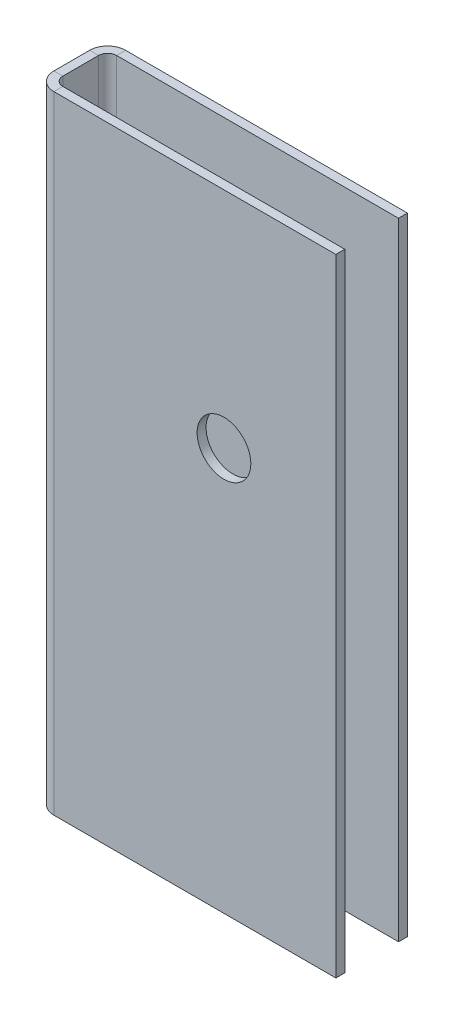
ISO-10303-21;
HEADER;
FILE_DESCRIPTION(('STEP AP214'),'2;1');
FILE_NAME('part.step','',(''),(''),'','','');
FILE_SCHEMA(('AUTOMOTIVE_DESIGN { 1 0 10303 214 1 1 1 1 }'));
ENDSEC;
DATA;
#1=APPLICATION_CONTEXT('core data for automotive mechanical design processes');
#2=APPLICATION_PROTOCOL_DEFINITION('international standard','automotive_design',2000,#1);
#3=PRODUCT_CONTEXT('',#1,'mechanical');
#4=PRODUCT('Part','Part','',(#3));
#5=PRODUCT_RELATED_PRODUCT_CATEGORY('part','',(#4));
#6=PRODUCT_DEFINITION_FORMATION('','',#4);
#7=PRODUCT_DEFINITION_CONTEXT('part definition',#1,'design');
#8=PRODUCT_DEFINITION('design','',#6,#7);
#9=PRODUCT_DEFINITION_SHAPE('','',#8);
#10=(LENGTH_UNIT() NAMED_UNIT(*) SI_UNIT(.MILLI.,.METRE.));
#11=(NAMED_UNIT(*) PLANE_ANGLE_UNIT() SI_UNIT($,.RADIAN.));
#12=(NAMED_UNIT(*) SI_UNIT($,.STERADIAN.) SOLID_ANGLE_UNIT());
#13=UNCERTAINTY_MEASURE_WITH_UNIT(LENGTH_MEASURE(1.E-05),#10,'distance_accuracy_value','');
#14=(GEOMETRIC_REPRESENTATION_CONTEXT(3) GLOBAL_UNCERTAINTY_ASSIGNED_CONTEXT((#13)) GLOBAL_UNIT_ASSIGNED_CONTEXT((#10,
#11,#12)) REPRESENTATION_CONTEXT('',''));
#15=CARTESIAN_POINT('',(0.,0.,0.));
#16=DIRECTION('',(0.,0.,1.));
#17=DIRECTION('',(1.,0.,0.));
#18=AXIS2_PLACEMENT_3D('',#15,#16,#17);
#19=CARTESIAN_POINT('',(-1073.5,140.,-8.00000000000001));
#20=DIRECTION('',(0.,1.,0.));
#21=DIRECTION('',(0.,0.,1.));
#22=AXIS2_PLACEMENT_3D('',#19,#20,#21);
#23=PLANE('',#22);
#24=DIRECTION('',(0.,0.,1.));
#25=VECTOR('',#24,1.);
#26=CARTESIAN_POINT('',(-1075.5,140.,-6.00000000000001));
#27=LINE('',#26,#25);
#28=CARTESIAN_POINT('',(-1075.5,140.,-4.));
#29=VERTEX_POINT('',#28);
#30=CARTESIAN_POINT('',(-1075.5,140.,3.99999999999993));
#31=VERTEX_POINT('',#30);
#32=EDGE_CURVE('E150',#29,#31,#27,.T.);
#33=ORIENTED_EDGE('',*,*,#32,.F.);
#34=DIRECTION('',(-1.,0.,0.));
#35=VECTOR('',#34,1.);
#36=CARTESIAN_POINT('',(-1075.5,140.,-4.));
#37=LINE('',#36,#35);
#38=CARTESIAN_POINT('',(-1077.5,140.,-4.));
#39=VERTEX_POINT('',#38);
#40=EDGE_CURVE('E146',#29,#39,#37,.T.);
#41=ORIENTED_EDGE('',*,*,#40,.T.);
#42=DIRECTION('',(0.,0.,-1.));
#43=VECTOR('',#42,1.);
#44=CARTESIAN_POINT('',(-1077.5,140.,-6.00000000000001));
#45=LINE('',#44,#43);
#46=CARTESIAN_POINT('',(-1077.5,140.,3.99999999999987));
#47=VERTEX_POINT('',#46);
#48=EDGE_CURVE('E155',#39,#47,#45,.F.);
#49=ORIENTED_EDGE('',*,*,#48,.T.);
#50=DIRECTION('',(1.,0.,0.));
#51=VECTOR('',#50,1.);
#52=CARTESIAN_POINT('',(-1077.5,140.,4.));
#53=LINE('',#52,#51);
#54=EDGE_CURVE('E129',#47,#31,#53,.T.);
#55=ORIENTED_EDGE('',*,*,#54,.T.);
#56=EDGE_LOOP('',(#33,#41,#49,#55));
#57=FACE_BOUND('',#56,.T.);
#58=ADVANCED_FACE('F36',(#57),#23,.T.);
#59=CARTESIAN_POINT('',(-1073.5,0.,8.00000000000001));
#60=DIRECTION('',(0.,-1.,0.));
#61=DIRECTION('',(0.,0.,-1.));
#62=AXIS2_PLACEMENT_3D('',#59,#60,#61);
#63=PLANE('',#62);
#64=DIRECTION('',(0.,0.,1.));
#65=VECTOR('',#64,1.);
#66=CARTESIAN_POINT('',(-1075.5,0.,-6.00000000000001));
#67=LINE('',#66,#65);
#68=CARTESIAN_POINT('',(-1075.5,0.,-4.));
#69=VERTEX_POINT('',#68);
#70=CARTESIAN_POINT('',(-1075.5,0.,3.99999999999994));
#71=VERTEX_POINT('',#70);
#72=EDGE_CURVE('E172',#69,#71,#67,.T.);
#73=ORIENTED_EDGE('',*,*,#72,.T.);
#74=DIRECTION('',(-1.,0.,0.));
#75=VECTOR('',#74,1.);
#76=CARTESIAN_POINT('',(-1075.5,0.,4.));
#77=LINE('',#76,#75);
#78=CARTESIAN_POINT('',(-1077.5,0.,4.));
#79=VERTEX_POINT('',#78);
#80=EDGE_CURVE('E11',#71,#79,#77,.T.);
#81=ORIENTED_EDGE('',*,*,#80,.T.);
#82=DIRECTION('',(0.,0.,-1.));
#83=VECTOR('',#82,1.);
#84=CARTESIAN_POINT('',(-1077.5,0.,-6.00000000000001));
#85=LINE('',#84,#83);
#86=CARTESIAN_POINT('',(-1077.5,0.,-4.));
#87=VERTEX_POINT('',#86);
#88=EDGE_CURVE('E156',#87,#79,#85,.F.);
#89=ORIENTED_EDGE('',*,*,#88,.F.);
#90=DIRECTION('',(1.,0.,0.));
#91=VECTOR('',#90,1.);
#92=CARTESIAN_POINT('',(-1077.5,0.,-4.));
#93=LINE('',#92,#91);
#94=EDGE_CURVE('E166',#87,#69,#93,.T.);
#95=ORIENTED_EDGE('',*,*,#94,.T.);
#96=EDGE_LOOP('',(#73,#81,#89,#95));
#97=FACE_BOUND('',#96,.T.);
#98=ADVANCED_FACE('F277',(#97),#63,.T.);
#99=CARTESIAN_POINT('',(-1075.5,140.,-6.00000000000001));
#100=DIRECTION('',(1.,0.,0.));
#101=DIRECTION('',(0.,0.,-1.));
#102=AXIS2_PLACEMENT_3D('',#99,#100,#101);
#103=PLANE('',#102);
#104=ORIENTED_EDGE('',*,*,#72,.F.);
#105=DIRECTION('',(0.,-1.,0.));
#106=VECTOR('',#105,1.);
#107=CARTESIAN_POINT('',(-1075.5,140.,-4.));
#108=LINE('',#107,#106);
#109=EDGE_CURVE('E152',#29,#69,#108,.T.);
#110=ORIENTED_EDGE('',*,*,#109,.F.);
#111=ORIENTED_EDGE('',*,*,#32,.T.);
#112=DIRECTION('',(0.,-1.,0.));
#113=VECTOR('',#112,1.);
#114=CARTESIAN_POINT('',(-1075.5,140.,4.));
#115=LINE('',#114,#113);
#116=EDGE_CURVE('E139',#31,#71,#115,.T.);
#117=ORIENTED_EDGE('',*,*,#116,.T.);
#118=EDGE_LOOP('',(#104,#110,#111,#117));
#119=FACE_BOUND('',#118,.T.);
#120=ADVANCED_FACE('F151',(#119),#103,.T.);
#121=CARTESIAN_POINT('',(-1077.5,140.,-6.00000000000001));
#122=DIRECTION('',(1.,0.,0.));
#123=DIRECTION('',(0.,0.,-1.));
#124=AXIS2_PLACEMENT_3D('',#121,#122,#123);
#125=PLANE('',#124);
#126=ORIENTED_EDGE('',*,*,#88,.T.);
#127=DIRECTION('',(0.,-1.,0.));
#128=VECTOR('',#127,1.);
#129=CARTESIAN_POINT('',(-1077.5,140.,4.));
#130=LINE('',#129,#128);
#131=EDGE_CURVE('E43',#47,#79,#130,.T.);
#132=ORIENTED_EDGE('',*,*,#131,.F.);
#133=ORIENTED_EDGE('',*,*,#48,.F.);
#134=DIRECTION('',(0.,-1.,0.));
#135=VECTOR('',#134,1.);
#136=CARTESIAN_POINT('',(-1077.5,140.,-4.));
#137=LINE('',#136,#135);
#138=EDGE_CURVE('E163',#39,#87,#137,.T.);
#139=ORIENTED_EDGE('',*,*,#138,.T.);
#140=EDGE_LOOP('',(#126,#132,#133,#139));
#141=FACE_BOUND('',#140,.T.);
#142=ADVANCED_FACE('F285',(#141),#125,.F.);
#143=CARTESIAN_POINT('',(-1073.5,140.,-4.));
#144=DIRECTION('',(0.,-1.,0.));
#145=DIRECTION('',(1.,0.,0.));
#146=AXIS2_PLACEMENT_3D('',#143,#144,#145);
#147=PLANE('',#146);
#148=DIRECTION('',(0.,0.,1.));
#149=VECTOR('',#148,1.);
#150=CARTESIAN_POINT('',(-1073.5,140.,-8.00000000000001));
#151=LINE('',#150,#149);
#152=CARTESIAN_POINT('',(-1073.5,140.,-8.00000000000001));
#153=VERTEX_POINT('',#152);
#154=CARTESIAN_POINT('',(-1073.5,140.,-6.00000000000001));
#155=VERTEX_POINT('',#154);
#156=EDGE_CURVE('E178',#153,#155,#151,.T.);
#157=ORIENTED_EDGE('',*,*,#156,.F.);
#158=CARTESIAN_POINT('',(-1073.5,140.,-4.));
#159=DIRECTION('',(0.,1.,0.));
#160=DIRECTION('',(-1.,0.,0.));
#161=AXIS2_PLACEMENT_3D('',#158,#159,#160);
#162=CIRCLE('',#161,4.);
#163=EDGE_CURVE('E57',#153,#39,#162,.T.);
#164=ORIENTED_EDGE('',*,*,#163,.T.);
#165=ORIENTED_EDGE('',*,*,#40,.F.);
#166=CARTESIAN_POINT('',(-1073.5,140.,-4.));
#167=DIRECTION('',(0.,1.,0.));
#168=DIRECTION('',(-1.,0.,0.));
#169=AXIS2_PLACEMENT_3D('',#166,#167,#168);
#170=CIRCLE('',#169,2.);
#171=EDGE_CURVE('E181',#155,#29,#170,.T.);
#172=ORIENTED_EDGE('',*,*,#171,.F.);
#173=EDGE_LOOP('',(#157,#164,#165,#172));
#174=FACE_BOUND('',#173,.T.);
#175=ADVANCED_FACE('F290',(#174),#147,.F.);
#176=CARTESIAN_POINT('',(-1073.5,0.,-4.));
#177=DIRECTION('',(0.,1.,0.));
#178=DIRECTION('',(-1.,0.,0.));
#179=AXIS2_PLACEMENT_3D('',#176,#177,#178);
#180=PLANE('',#179);
#181=ORIENTED_EDGE('',*,*,#94,.F.);
#182=CARTESIAN_POINT('',(-1073.5,0.,-4.));
#183=DIRECTION('',(0.,1.,0.));
#184=DIRECTION('',(-1.,0.,0.));
#185=AXIS2_PLACEMENT_3D('',#182,#183,#184);
#186=CIRCLE('',#185,4.);
#187=CARTESIAN_POINT('',(-1073.5,0.,-8.00000000000001));
#188=VERTEX_POINT('',#187);
#189=EDGE_CURVE('E177',#87,#188,#186,.F.);
#190=ORIENTED_EDGE('',*,*,#189,.T.);
#191=DIRECTION('',(0.,0.,-1.));
#192=VECTOR('',#191,1.);
#193=CARTESIAN_POINT('',(-1073.5,0.,-6.00000000000001));
#194=LINE('',#193,#192);
#195=CARTESIAN_POINT('',(-1073.5,0.,-6.00000000000001));
#196=VERTEX_POINT('',#195);
#197=EDGE_CURVE('E202',#196,#188,#194,.T.);
#198=ORIENTED_EDGE('',*,*,#197,.F.);
#199=CARTESIAN_POINT('',(-1073.5,0.,-4.));
#200=DIRECTION('',(0.,-1.,0.));
#201=DIRECTION('',(1.,0.,0.));
#202=AXIS2_PLACEMENT_3D('',#199,#200,#201);
#203=CIRCLE('',#202,2.);
#204=EDGE_CURVE('E174',#69,#196,#203,.T.);
#205=ORIENTED_EDGE('',*,*,#204,.F.);
#206=EDGE_LOOP('',(#181,#190,#198,#205));
#207=FACE_BOUND('',#206,.T.);
#208=ADVANCED_FACE('F294',(#207),#180,.F.);
#209=CARTESIAN_POINT('',(-1073.5,-70.0714157829591,-4.));
#210=DIRECTION('',(0.,1.,0.));
#211=DIRECTION('',(-1.,0.,0.));
#212=AXIS2_PLACEMENT_3D('',#209,#210,#211);
#213=CYLINDRICAL_SURFACE('',#212,2.);
#214=ORIENTED_EDGE('',*,*,#204,.T.);
#215=DIRECTION('',(0.,-1.,0.));
#216=VECTOR('',#215,1.);
#217=CARTESIAN_POINT('',(-1073.5,140.,-6.00000000000001));
#218=LINE('',#217,#216);
#219=EDGE_CURVE('E197',#155,#196,#218,.T.);
#220=ORIENTED_EDGE('',*,*,#219,.F.);
#221=ORIENTED_EDGE('',*,*,#171,.T.);
#222=ORIENTED_EDGE('',*,*,#109,.T.);
#223=EDGE_LOOP('',(#214,#220,#221,#222));
#224=FACE_BOUND('',#223,.T.);
#225=ADVANCED_FACE('F297',(#224),#213,.F.);
#226=CARTESIAN_POINT('',(-1073.5,-70.0714157829591,-4.));
#227=DIRECTION('',(0.,1.,0.));
#228=DIRECTION('',(-1.,0.,0.));
#229=AXIS2_PLACEMENT_3D('',#226,#227,#228);
#230=CYLINDRICAL_SURFACE('',#229,4.);
#231=ORIENTED_EDGE('',*,*,#189,.F.);
#232=ORIENTED_EDGE('',*,*,#138,.F.);
#233=ORIENTED_EDGE('',*,*,#163,.F.);
#234=DIRECTION('',(0.,-1.,0.));
#235=VECTOR('',#234,1.);
#236=CARTESIAN_POINT('',(-1073.5,140.,-8.00000000000001));
#237=LINE('',#236,#235);
#238=EDGE_CURVE('E186',#153,#188,#237,.T.);
#239=ORIENTED_EDGE('',*,*,#238,.T.);
#240=EDGE_LOOP('',(#231,#232,#233,#239));
#241=FACE_BOUND('',#240,.T.);
#242=ADVANCED_FACE('F299',(#241),#230,.T.);
#243=CARTESIAN_POINT('',(-1010.5,140.,-8.00000000000001));
#244=DIRECTION('',(1.,0.,0.));
#245=DIRECTION('',(0.,0.,-1.));
#246=AXIS2_PLACEMENT_3D('',#243,#244,#245);
#247=PLANE('',#246);
#248=DIRECTION('',(0.,0.,1.));
#249=VECTOR('',#248,1.);
#250=CARTESIAN_POINT('',(-1010.5,0.,-8.00000000000001));
#251=LINE('',#250,#249);
#252=CARTESIAN_POINT('',(-1010.5,0.,-8.00000000000001));
#253=VERTEX_POINT('',#252);
#254=CARTESIAN_POINT('',(-1010.5,0.,-6.00000000000001));
#255=VERTEX_POINT('',#254);
#256=EDGE_CURVE('E205',#253,#255,#251,.T.);
#257=ORIENTED_EDGE('',*,*,#256,.F.);
#258=DIRECTION('',(0.,-1.,0.));
#259=VECTOR('',#258,1.);
#260=CARTESIAN_POINT('',(-1010.5,140.,-8.00000000000001));
#261=LINE('',#260,#259);
#262=CARTESIAN_POINT('',(-1010.5,140.,-8.00000000000001));
#263=VERTEX_POINT('',#262);
#264=EDGE_CURVE('E210',#263,#253,#261,.T.);
#265=ORIENTED_EDGE('',*,*,#264,.F.);
#266=DIRECTION('',(0.,0.,1.));
#267=VECTOR('',#266,1.);
#268=CARTESIAN_POINT('',(-1010.5,140.,-8.00000000000001));
#269=LINE('',#268,#267);
#270=CARTESIAN_POINT('',(-1010.5,140.,-6.00000000000001));
#271=VERTEX_POINT('',#270);
#272=EDGE_CURVE('E189',#263,#271,#269,.T.);
#273=ORIENTED_EDGE('',*,*,#272,.T.);
#274=DIRECTION('',(0.,-1.,0.));
#275=VECTOR('',#274,1.);
#276=CARTESIAN_POINT('',(-1010.5,140.,-6.00000000000001));
#277=LINE('',#276,#275);
#278=EDGE_CURVE('E193',#271,#255,#277,.T.);
#279=ORIENTED_EDGE('',*,*,#278,.T.);
#280=EDGE_LOOP('',(#257,#265,#273,#279));
#281=FACE_BOUND('',#280,.T.);
#282=ADVANCED_FACE('F302',(#281),#247,.T.);
#283=CARTESIAN_POINT('',(-1010.5,140.,-6.00000000000001));
#284=DIRECTION('',(0.,0.,1.));
#285=DIRECTION('',(1.,0.,0.));
#286=AXIS2_PLACEMENT_3D('',#283,#284,#285);
#287=PLANE('',#286);
#288=CARTESIAN_POINT('',(-1035.5,90.,-6.00000000000001));
#289=DIRECTION('',(0.,0.,1.));
#290=DIRECTION('',(1.,0.,0.));
#291=AXIS2_PLACEMENT_3D('',#288,#289,#290);
#292=CIRCLE('',#291,6.0000000000001);
#293=CARTESIAN_POINT('',(-1029.5,90.,-6.00000000000001));
#294=VERTEX_POINT('',#293);
#295=EDGE_CURVE('E247',#294,#294,#292,.T.);
#296=ORIENTED_EDGE('',*,*,#295,.F.);
#297=EDGE_LOOP('',(#296));
#298=FACE_BOUND('',#297,.T.);
#299=DIRECTION('',(-1.,0.,0.));
#300=VECTOR('',#299,1.);
#301=CARTESIAN_POINT('',(-1010.5,0.,-6.00000000000001));
#302=LINE('',#301,#300);
#303=EDGE_CURVE('E200',#255,#196,#302,.T.);
#304=ORIENTED_EDGE('',*,*,#303,.F.);
#305=ORIENTED_EDGE('',*,*,#278,.F.);
#306=DIRECTION('',(-1.,0.,0.));
#307=VECTOR('',#306,1.);
#308=CARTESIAN_POINT('',(-1010.5,140.,-6.00000000000001));
#309=LINE('',#308,#307);
#310=EDGE_CURVE('E195',#271,#155,#309,.T.);
#311=ORIENTED_EDGE('',*,*,#310,.T.);
#312=ORIENTED_EDGE('',*,*,#219,.T.);
#313=EDGE_LOOP('',(#304,#305,#311,#312));
#314=FACE_BOUND('',#313,.T.);
#315=ADVANCED_FACE('F317',(#298,#314),#287,.T.);
#316=CARTESIAN_POINT('',(-1077.5,0.,-4.));
#317=DIRECTION('',(0.,-1.,0.));
#318=DIRECTION('',(0.,0.,-1.));
#319=AXIS2_PLACEMENT_3D('',#316,#317,#318);
#320=PLANE('',#319);
#321=ORIENTED_EDGE('',*,*,#303,.T.);
#322=ORIENTED_EDGE('',*,*,#197,.T.);
#323=DIRECTION('',(1.,0.,0.));
#324=VECTOR('',#323,1.);
#325=CARTESIAN_POINT('',(-1010.5,0.,-8.00000000000001));
#326=LINE('',#325,#324);
#327=EDGE_CURVE('E208',#253,#188,#326,.F.);
#328=ORIENTED_EDGE('',*,*,#327,.F.);
#329=ORIENTED_EDGE('',*,*,#256,.T.);
#330=EDGE_LOOP('',(#321,#322,#328,#329));
#331=FACE_BOUND('',#330,.T.);
#332=ADVANCED_FACE('F314',(#331),#320,.T.);
#333=CARTESIAN_POINT('',(-1010.5,140.,-8.00000000000001));
#334=DIRECTION('',(0.,0.,1.));
#335=DIRECTION('',(1.,0.,0.));
#336=AXIS2_PLACEMENT_3D('',#333,#334,#335);
#337=PLANE('',#336);
#338=CARTESIAN_POINT('',(-1035.5,90.,-8.00000000000001));
#339=DIRECTION('',(0.,0.,1.));
#340=DIRECTION('',(1.,0.,0.));
#341=AXIS2_PLACEMENT_3D('',#338,#339,#340);
#342=CIRCLE('',#341,6.0000000000001);
#343=CARTESIAN_POINT('',(-1029.5,90.,-8.00000000000001));
#344=VERTEX_POINT('',#343);
#345=EDGE_CURVE('E255',#344,#344,#342,.T.);
#346=ORIENTED_EDGE('',*,*,#345,.T.);
#347=EDGE_LOOP('',(#346));
#348=FACE_BOUND('',#347,.T.);
#349=ORIENTED_EDGE('',*,*,#327,.T.);
#350=ORIENTED_EDGE('',*,*,#238,.F.);
#351=DIRECTION('',(1.,0.,0.));
#352=VECTOR('',#351,1.);
#353=CARTESIAN_POINT('',(-1010.5,140.,-8.00000000000001));
#354=LINE('',#353,#352);
#355=EDGE_CURVE('E212',#263,#153,#354,.F.);
#356=ORIENTED_EDGE('',*,*,#355,.F.);
#357=ORIENTED_EDGE('',*,*,#264,.T.);
#358=EDGE_LOOP('',(#349,#350,#356,#357));
#359=FACE_BOUND('',#358,.T.);
#360=ADVANCED_FACE('F262',(#348,#359),#337,.F.);
#361=CARTESIAN_POINT('',(-1073.5,140.,4.));
#362=DIRECTION('',(0.,-1.,0.));
#363=DIRECTION('',(-1.,0.,0.));
#364=AXIS2_PLACEMENT_3D('',#361,#362,#363);
#365=PLANE('',#364);
#366=ORIENTED_EDGE('',*,*,#355,.T.);
#367=ORIENTED_EDGE('',*,*,#156,.T.);
#368=ORIENTED_EDGE('',*,*,#310,.F.);
#369=ORIENTED_EDGE('',*,*,#272,.F.);
#370=EDGE_LOOP('',(#366,#367,#368,#369));
#371=FACE_BOUND('',#370,.T.);
#372=ADVANCED_FACE('F307',(#371),#365,.F.);
#373=CARTESIAN_POINT('',(-1010.5,140.,6.));
#374=DIRECTION('',(1.,0.,0.));
#375=DIRECTION('',(0.,0.,-1.));
#376=AXIS2_PLACEMENT_3D('',#373,#374,#375);
#377=PLANE('',#376);
#378=DIRECTION('',(0.,0.,1.));
#379=VECTOR('',#378,1.);
#380=CARTESIAN_POINT('',(-1010.5,0.,6.));
#381=LINE('',#380,#379);
#382=CARTESIAN_POINT('',(-1010.5,0.,6.));
#383=VERTEX_POINT('',#382);
#384=CARTESIAN_POINT('',(-1010.5,0.,8.));
#385=VERTEX_POINT('',#384);
#386=EDGE_CURVE('E190',#383,#385,#381,.T.);
#387=ORIENTED_EDGE('',*,*,#386,.F.);
#388=DIRECTION('',(0.,-1.,0.));
#389=VECTOR('',#388,1.);
#390=CARTESIAN_POINT('',(-1010.5,140.,6.));
#391=LINE('',#390,#389);
#392=CARTESIAN_POINT('',(-1010.5,140.,6.));
#393=VERTEX_POINT('',#392);
#394=EDGE_CURVE('E226',#393,#383,#391,.T.);
#395=ORIENTED_EDGE('',*,*,#394,.F.);
#396=DIRECTION('',(0.,0.,1.));
#397=VECTOR('',#396,1.);
#398=CARTESIAN_POINT('',(-1010.5,140.,6.));
#399=LINE('',#398,#397);
#400=CARTESIAN_POINT('',(-1010.5,140.,8.));
#401=VERTEX_POINT('',#400);
#402=EDGE_CURVE('E218',#393,#401,#399,.T.);
#403=ORIENTED_EDGE('',*,*,#402,.T.);
#404=DIRECTION('',(0.,-1.,0.));
#405=VECTOR('',#404,1.);
#406=CARTESIAN_POINT('',(-1010.5,140.,8.));
#407=LINE('',#406,#405);
#408=EDGE_CURVE('E221',#401,#385,#407,.T.);
#409=ORIENTED_EDGE('',*,*,#408,.T.);
#410=EDGE_LOOP('',(#387,#395,#403,#409));
#411=FACE_BOUND('',#410,.T.);
#412=ADVANCED_FACE('F310',(#411),#377,.T.);
#413=CARTESIAN_POINT('',(-1075.5,140.,6.));
#414=DIRECTION('',(0.,0.,-1.));
#415=DIRECTION('',(-1.,0.,0.));
#416=AXIS2_PLACEMENT_3D('',#413,#414,#415);
#417=PLANE('',#416);
#418=CARTESIAN_POINT('',(-1035.5,90.,6.));
#419=DIRECTION('',(0.,0.,-1.));
#420=DIRECTION('',(-1.,0.,0.));
#421=AXIS2_PLACEMENT_3D('',#418,#419,#420);
#422=CIRCLE('',#421,6.0000000000001);
#423=CARTESIAN_POINT('',(-1041.5,90.,6.));
#424=VERTEX_POINT('',#423);
#425=EDGE_CURVE('E252',#424,#424,#422,.T.);
#426=ORIENTED_EDGE('',*,*,#425,.F.);
#427=EDGE_LOOP('',(#426));
#428=FACE_BOUND('',#427,.T.);
#429=DIRECTION('',(1.,0.,0.));
#430=VECTOR('',#429,1.);
#431=CARTESIAN_POINT('',(-1075.5,0.,6.));
#432=LINE('',#431,#430);
#433=CARTESIAN_POINT('',(-1073.5,0.,6.));
#434=VERTEX_POINT('',#433);
#435=EDGE_CURVE('E240',#434,#383,#432,.T.);
#436=ORIENTED_EDGE('',*,*,#435,.F.);
#437=DIRECTION('',(0.,-1.,0.));
#438=VECTOR('',#437,1.);
#439=CARTESIAN_POINT('',(-1073.5,140.,6.));
#440=LINE('',#439,#438);
#441=CARTESIAN_POINT('',(-1073.5,140.,6.));
#442=VERTEX_POINT('',#441);
#443=EDGE_CURVE('E216',#442,#434,#440,.T.);
#444=ORIENTED_EDGE('',*,*,#443,.F.);
#445=DIRECTION('',(1.,0.,0.));
#446=VECTOR('',#445,1.);
#447=CARTESIAN_POINT('',(-1075.5,140.,6.));
#448=LINE('',#447,#446);
#449=EDGE_CURVE('E223',#442,#393,#448,.T.);
#450=ORIENTED_EDGE('',*,*,#449,.T.);
#451=ORIENTED_EDGE('',*,*,#394,.T.);
#452=EDGE_LOOP('',(#436,#444,#450,#451));
#453=FACE_BOUND('',#452,.T.);
#454=ADVANCED_FACE('F336',(#428,#453),#417,.T.);
#455=CARTESIAN_POINT('',(-1077.5,140.,4.));
#456=DIRECTION('',(0.,1.,0.));
#457=DIRECTION('',(0.,0.,1.));
#458=AXIS2_PLACEMENT_3D('',#455,#456,#457);
#459=PLANE('',#458);
#460=ORIENTED_EDGE('',*,*,#449,.F.);
#461=DIRECTION('',(0.,0.,1.));
#462=VECTOR('',#461,1.);
#463=CARTESIAN_POINT('',(-1073.5,140.,6.));
#464=LINE('',#463,#462);
#465=CARTESIAN_POINT('',(-1073.5,140.,8.));
#466=VERTEX_POINT('',#465);
#467=EDGE_CURVE('E131',#442,#466,#464,.T.);
#468=ORIENTED_EDGE('',*,*,#467,.T.);
#469=DIRECTION('',(1.,0.,0.));
#470=VECTOR('',#469,1.);
#471=CARTESIAN_POINT('',(-1075.5,140.,8.));
#472=LINE('',#471,#470);
#473=EDGE_CURVE('E229',#466,#401,#472,.T.);
#474=ORIENTED_EDGE('',*,*,#473,.T.);
#475=ORIENTED_EDGE('',*,*,#402,.F.);
#476=EDGE_LOOP('',(#460,#468,#474,#475));
#477=FACE_BOUND('',#476,.T.);
#478=ADVANCED_FACE('F332',(#477),#459,.T.);
#479=CARTESIAN_POINT('',(-1075.5,140.,8.));
#480=DIRECTION('',(0.,0.,-1.));
#481=DIRECTION('',(-1.,0.,0.));
#482=AXIS2_PLACEMENT_3D('',#479,#480,#481);
#483=PLANE('',#482);
#484=CARTESIAN_POINT('',(-1035.5,90.,8.));
#485=DIRECTION('',(0.,0.,1.));
#486=DIRECTION('',(1.,0.,0.));
#487=AXIS2_PLACEMENT_3D('',#484,#485,#486);
#488=CIRCLE('',#487,6.0000000000001);
#489=CARTESIAN_POINT('',(-1029.5,90.,8.));
#490=VERTEX_POINT('',#489);
#491=EDGE_CURVE('E256',#490,#490,#488,.T.);
#492=ORIENTED_EDGE('',*,*,#491,.F.);
#493=EDGE_LOOP('',(#492));
#494=FACE_BOUND('',#493,.T.);
#495=DIRECTION('',(1.,0.,0.));
#496=VECTOR('',#495,1.);
#497=CARTESIAN_POINT('',(-1075.5,0.,8.));
#498=LINE('',#497,#496);
#499=CARTESIAN_POINT('',(-1073.5,0.,8.));
#500=VERTEX_POINT('',#499);
#501=EDGE_CURVE('E231',#500,#385,#498,.T.);
#502=ORIENTED_EDGE('',*,*,#501,.T.);
#503=ORIENTED_EDGE('',*,*,#408,.F.);
#504=ORIENTED_EDGE('',*,*,#473,.F.);
#505=DIRECTION('',(0.,-1.,0.));
#506=VECTOR('',#505,1.);
#507=CARTESIAN_POINT('',(-1073.5,140.,8.));
#508=LINE('',#507,#506);
#509=EDGE_CURVE('E234',#466,#500,#508,.T.);
#510=ORIENTED_EDGE('',*,*,#509,.T.);
#511=EDGE_LOOP('',(#502,#503,#504,#510));
#512=FACE_BOUND('',#511,.T.);
#513=ADVANCED_FACE('F328',(#494,#512),#483,.F.);
#514=CARTESIAN_POINT('',(-1073.5,0.,4.));
#515=DIRECTION('',(0.,-1.,0.));
#516=DIRECTION('',(-1.,0.,0.));
#517=AXIS2_PLACEMENT_3D('',#514,#515,#516);
#518=PLANE('',#517);
#519=ORIENTED_EDGE('',*,*,#501,.F.);
#520=DIRECTION('',(0.,0.,-1.));
#521=VECTOR('',#520,1.);
#522=CARTESIAN_POINT('',(-1073.5,0.,8.));
#523=LINE('',#522,#521);
#524=EDGE_CURVE('E237',#500,#434,#523,.T.);
#525=ORIENTED_EDGE('',*,*,#524,.T.);
#526=ORIENTED_EDGE('',*,*,#435,.T.);
#527=ORIENTED_EDGE('',*,*,#386,.T.);
#528=EDGE_LOOP('',(#519,#525,#526,#527));
#529=FACE_BOUND('',#528,.T.);
#530=ADVANCED_FACE('F325',(#529),#518,.T.);
#531=CARTESIAN_POINT('',(-1073.5,140.,4.));
#532=DIRECTION('',(0.,-1.,0.));
#533=DIRECTION('',(0.,0.,-1.));
#534=AXIS2_PLACEMENT_3D('',#531,#532,#533);
#535=PLANE('',#534);
#536=ORIENTED_EDGE('',*,*,#54,.F.);
#537=CARTESIAN_POINT('',(-1073.5,140.,4.));
#538=DIRECTION('',(0.,1.,0.));
#539=DIRECTION('',(0.,0.,1.));
#540=AXIS2_PLACEMENT_3D('',#537,#538,#539);
#541=CIRCLE('',#540,4.);
#542=EDGE_CURVE('E245',#47,#466,#541,.T.);
#543=ORIENTED_EDGE('',*,*,#542,.T.);
#544=ORIENTED_EDGE('',*,*,#467,.F.);
#545=CARTESIAN_POINT('',(-1073.5,140.,4.));
#546=DIRECTION('',(0.,1.,0.));
#547=DIRECTION('',(0.,0.,1.));
#548=AXIS2_PLACEMENT_3D('',#545,#546,#547);
#549=CIRCLE('',#548,2.);
#550=EDGE_CURVE('E125',#31,#442,#549,.T.);
#551=ORIENTED_EDGE('',*,*,#550,.F.);
#552=EDGE_LOOP('',(#536,#543,#544,#551));
#553=FACE_BOUND('',#552,.T.);
#554=ADVANCED_FACE('F127',(#553),#535,.F.);
#555=CARTESIAN_POINT('',(-1073.5,0.,4.));
#556=DIRECTION('',(0.,1.,0.));
#557=DIRECTION('',(0.,0.,1.));
#558=AXIS2_PLACEMENT_3D('',#555,#556,#557);
#559=PLANE('',#558);
#560=ORIENTED_EDGE('',*,*,#524,.F.);
#561=CARTESIAN_POINT('',(-1073.5,0.,4.));
#562=DIRECTION('',(0.,1.,0.));
#563=DIRECTION('',(0.,0.,1.));
#564=AXIS2_PLACEMENT_3D('',#561,#562,#563);
#565=CIRCLE('',#564,4.);
#566=EDGE_CURVE('E135',#500,#79,#565,.F.);
#567=ORIENTED_EDGE('',*,*,#566,.T.);
#568=ORIENTED_EDGE('',*,*,#80,.F.);
#569=CARTESIAN_POINT('',(-1073.5,0.,4.));
#570=DIRECTION('',(0.,-1.,0.));
#571=DIRECTION('',(0.,0.,-1.));
#572=AXIS2_PLACEMENT_3D('',#569,#570,#571);
#573=CIRCLE('',#572,2.);
#574=EDGE_CURVE('E134',#434,#71,#573,.T.);
#575=ORIENTED_EDGE('',*,*,#574,.F.);
#576=EDGE_LOOP('',(#560,#567,#568,#575));
#577=FACE_BOUND('',#576,.T.);
#578=ADVANCED_FACE('F346',(#577),#559,.F.);
#579=CARTESIAN_POINT('',(-1073.5,-70.0714157829591,4.));
#580=DIRECTION('',(0.,1.,0.));
#581=DIRECTION('',(0.,0.,1.));
#582=AXIS2_PLACEMENT_3D('',#579,#580,#581);
#583=CYLINDRICAL_SURFACE('',#582,2.);
#584=ORIENTED_EDGE('',*,*,#574,.T.);
#585=ORIENTED_EDGE('',*,*,#116,.F.);
#586=ORIENTED_EDGE('',*,*,#550,.T.);
#587=ORIENTED_EDGE('',*,*,#443,.T.);
#588=EDGE_LOOP('',(#584,#585,#586,#587));
#589=FACE_BOUND('',#588,.T.);
#590=ADVANCED_FACE('F141',(#589),#583,.F.);
#591=CARTESIAN_POINT('',(-1073.5,-70.0714157829591,4.));
#592=DIRECTION('',(0.,1.,0.));
#593=DIRECTION('',(0.,0.,1.));
#594=AXIS2_PLACEMENT_3D('',#591,#592,#593);
#595=CYLINDRICAL_SURFACE('',#594,4.);
#596=ORIENTED_EDGE('',*,*,#566,.F.);
#597=ORIENTED_EDGE('',*,*,#509,.F.);
#598=ORIENTED_EDGE('',*,*,#542,.F.);
#599=ORIENTED_EDGE('',*,*,#131,.T.);
#600=EDGE_LOOP('',(#596,#597,#598,#599));
#601=FACE_BOUND('',#600,.T.);
#602=ADVANCED_FACE('F273',(#601),#595,.T.);
#603=CARTESIAN_POINT('',(-1035.5,90.,-8.00000000000001));
#604=DIRECTION('',(0.,0.,1.));
#605=DIRECTION('',(1.,0.,0.));
#606=AXIS2_PLACEMENT_3D('',#603,#604,#605);
#607=CYLINDRICAL_SURFACE('',#606,6.0000000000001);
#608=ORIENTED_EDGE('',*,*,#425,.T.);
#609=EDGE_LOOP('',(#608));
#610=FACE_BOUND('',#609,.T.);
#611=ORIENTED_EDGE('',*,*,#491,.T.);
#612=EDGE_LOOP('',(#611));
#613=FACE_BOUND('',#612,.T.);
#614=ADVANCED_FACE('F267',(#610,#613),#607,.F.);
#615=ORIENTED_EDGE('',*,*,#295,.T.);
#616=EDGE_LOOP('',(#615));
#617=FACE_BOUND('',#616,.T.);
#618=ORIENTED_EDGE('',*,*,#345,.F.);
#619=EDGE_LOOP('',(#618));
#620=FACE_BOUND('',#619,.T.);
#621=ADVANCED_FACE('F265',(#617,#620),#607,.F.);
#622=CLOSED_SHELL('',(#58,#98,#120,#142,#175,#208,#225,#242,#282,#315,#332,#360,#372,#412,#454,
#478,#513,#530,#554,#578,#590,#602,#614,#621));
#623=MANIFOLD_SOLID_BREP('B2',#622);
#624=ADVANCED_BREP_SHAPE_REPRESENTATION('',(#18,#623),#14);
#625=SHAPE_DEFINITION_REPRESENTATION(#9,#624);
ENDSEC;
END-ISO-10303-21;
